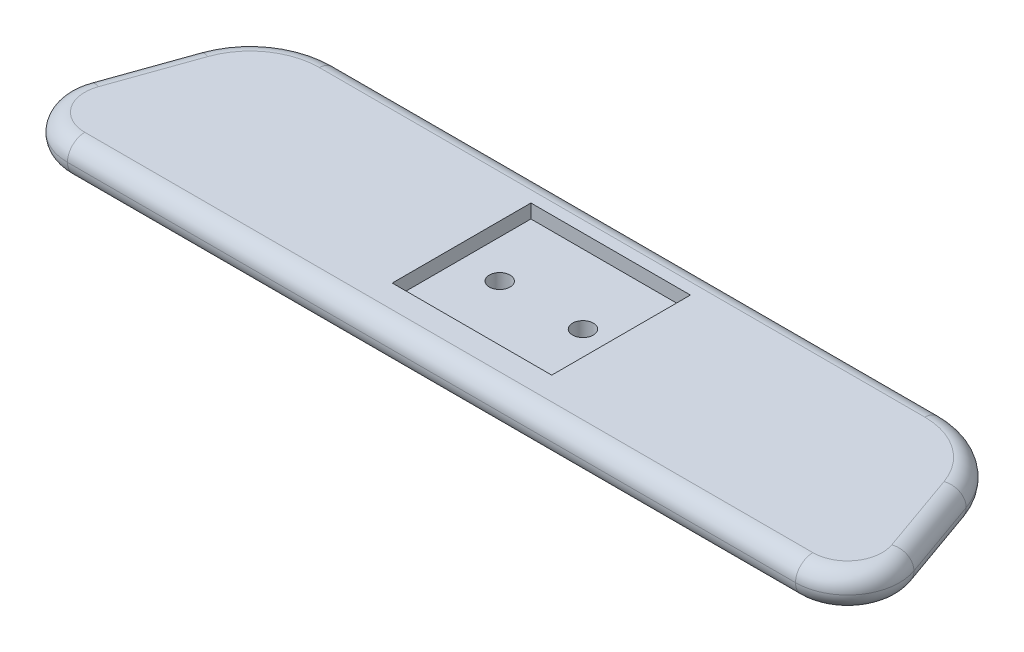
ISO-10303-21;
HEADER;
FILE_DESCRIPTION(('STEP AP214'),'2;1');
FILE_NAME('part.step','',(''),(''),'','','');
FILE_SCHEMA(('AUTOMOTIVE_DESIGN { 1 0 10303 214 1 1 1 1 }'));
ENDSEC;
DATA;
#1=APPLICATION_CONTEXT('core data for automotive mechanical design processes');
#2=APPLICATION_PROTOCOL_DEFINITION('international standard','automotive_design',2000,#1);
#3=PRODUCT_CONTEXT('',#1,'mechanical');
#4=PRODUCT('Part','Part','',(#3));
#5=PRODUCT_RELATED_PRODUCT_CATEGORY('part','',(#4));
#6=PRODUCT_DEFINITION_FORMATION('','',#4);
#7=PRODUCT_DEFINITION_CONTEXT('part definition',#1,'design');
#8=PRODUCT_DEFINITION('design','',#6,#7);
#9=PRODUCT_DEFINITION_SHAPE('','',#8);
#10=(LENGTH_UNIT() NAMED_UNIT(*) SI_UNIT(.MILLI.,.METRE.));
#11=(NAMED_UNIT(*) PLANE_ANGLE_UNIT() SI_UNIT($,.RADIAN.));
#12=(NAMED_UNIT(*) SI_UNIT($,.STERADIAN.) SOLID_ANGLE_UNIT());
#13=UNCERTAINTY_MEASURE_WITH_UNIT(LENGTH_MEASURE(1.E-05),#10,'distance_accuracy_value','');
#14=(GEOMETRIC_REPRESENTATION_CONTEXT(3) GLOBAL_UNCERTAINTY_ASSIGNED_CONTEXT((#13)) GLOBAL_UNIT_ASSIGNED_CONTEXT((#10,
#11,#12)) REPRESENTATION_CONTEXT('',''));
#15=CARTESIAN_POINT('',(0.,0.,0.));
#16=DIRECTION('',(0.,0.,1.));
#17=DIRECTION('',(1.,0.,0.));
#18=AXIS2_PLACEMENT_3D('',#15,#16,#17);
#19=CARTESIAN_POINT('',(-105.,5.,16.6761371846754));
#20=DIRECTION('',(0.,-1.,0.));
#21=DIRECTION('',(0.,0.,-1.));
#22=AXIS2_PLACEMENT_3D('',#19,#20,#21);
#23=PLANE('',#22);
#24=DIRECTION('',(-0.333806859233774,0.,0.942641491092177));
#25=VECTOR('',#24,1.);
#26=CARTESIAN_POINT('',(-114.426414910922,5.,13.3380685923377));
#27=LINE('',#26,#25);
#28=CARTESIAN_POINT('',(-106.16197137538,5.,-10.));
#29=VERTEX_POINT('',#28);
#30=CARTESIAN_POINT('',(-114.426414910922,5.,13.3380685923377));
#31=VERTEX_POINT('',#30);
#32=EDGE_CURVE('E59',#29,#31,#27,.T.);
#33=ORIENTED_EDGE('',*,*,#32,.T.);
#34=CARTESIAN_POINT('',(-105.,5.,16.6761371846754));
#35=DIRECTION('',(0.,-1.,0.));
#36=DIRECTION('',(0.,0.,-1.));
#37=AXIS2_PLACEMENT_3D('',#34,#35,#36);
#38=CIRCLE('',#37,9.99999999999999);
#39=CARTESIAN_POINT('',(-105.,5.,26.6761371846754));
#40=VERTEX_POINT('',#39);
#41=EDGE_CURVE('E12',#31,#40,#38,.F.);
#42=ORIENTED_EDGE('',*,*,#41,.T.);
#43=DIRECTION('',(1.,0.,0.));
#44=VECTOR('',#43,1.);
#45=CARTESIAN_POINT('',(-105.,5.,26.6761371846754));
#46=LINE('',#45,#44);
#47=CARTESIAN_POINT('',(105.,5.,26.6761371846755));
#48=VERTEX_POINT('',#47);
#49=EDGE_CURVE('E350',#40,#48,#46,.T.);
#50=ORIENTED_EDGE('',*,*,#49,.T.);
#51=CARTESIAN_POINT('',(105.,5.,16.6761371846755));
#52=DIRECTION('',(0.,-1.,0.));
#53=DIRECTION('',(0.,0.,-1.));
#54=AXIS2_PLACEMENT_3D('',#51,#52,#53);
#55=CIRCLE('',#54,10.);
#56=CARTESIAN_POINT('',(114.426414910922,5.,13.3380685923377));
#57=VERTEX_POINT('',#56);
#58=EDGE_CURVE('E351',#48,#57,#55,.F.);
#59=ORIENTED_EDGE('',*,*,#58,.T.);
#60=DIRECTION('',(-0.333806859233772,0.,-0.942641491092178));
#61=VECTOR('',#60,1.);
#62=CARTESIAN_POINT('',(91.0267408639035,5.,-52.7405724678954));
#63=LINE('',#62,#61);
#64=CARTESIAN_POINT('',(106.16197137538,5.,-9.99999999999998));
#65=VERTEX_POINT('',#64);
#66=EDGE_CURVE('E353',#57,#65,#63,.T.);
#67=ORIENTED_EDGE('',*,*,#66,.T.);
#68=CARTESIAN_POINT('',(87.309141553536,5.,-3.32386281532454));
#69=DIRECTION('',(0.,-1.,0.));
#70=DIRECTION('',(0.,0.,-1.));
#71=AXIS2_PLACEMENT_3D('',#68,#69,#70);
#72=CIRCLE('',#71,20.);
#73=CARTESIAN_POINT('',(87.309141553536,5.,-23.3238628153245));
#74=VERTEX_POINT('',#73);
#75=EDGE_CURVE('E173',#65,#74,#72,.F.);
#76=ORIENTED_EDGE('',*,*,#75,.T.);
#77=DIRECTION('',(-1.,0.,0.));
#78=VECTOR('',#77,1.);
#79=CARTESIAN_POINT('',(-105.,5.,-23.3238628153246));
#80=LINE('',#79,#78);
#81=CARTESIAN_POINT('',(-87.309141553536,5.,-23.3238628153246));
#82=VERTEX_POINT('',#81);
#83=EDGE_CURVE('E166',#74,#82,#80,.T.);
#84=ORIENTED_EDGE('',*,*,#83,.T.);
#85=CARTESIAN_POINT('',(-87.309141553536,5.,-3.32386281532456));
#86=DIRECTION('',(0.,-1.,0.));
#87=DIRECTION('',(0.,0.,-1.));
#88=AXIS2_PLACEMENT_3D('',#85,#86,#87);
#89=CIRCLE('',#88,20.);
#90=EDGE_CURVE('E171',#82,#29,#89,.F.);
#91=ORIENTED_EDGE('',*,*,#90,.T.);
#92=EDGE_LOOP('',(#33,#42,#50,#59,#67,#76,#84,#91));
#93=FACE_BOUND('',#92,.T.);
#94=DIRECTION('',(0.,0.,-1.));
#95=VECTOR('',#94,1.);
#96=CARTESIAN_POINT('',(23.,5.,16.6761371846754));
#97=LINE('',#96,#95);
#98=CARTESIAN_POINT('',(23.,5.,20.));
#99=VERTEX_POINT('',#98);
#100=CARTESIAN_POINT('',(23.,5.,-20.));
#101=VERTEX_POINT('',#100);
#102=EDGE_CURVE('E318',#99,#101,#97,.T.);
#103=ORIENTED_EDGE('',*,*,#102,.F.);
#104=DIRECTION('',(1.,0.,0.));
#105=VECTOR('',#104,1.);
#106=CARTESIAN_POINT('',(-105.,5.,20.));
#107=LINE('',#106,#105);
#108=CARTESIAN_POINT('',(-23.,5.,20.));
#109=VERTEX_POINT('',#108);
#110=EDGE_CURVE('E309',#109,#99,#107,.T.);
#111=ORIENTED_EDGE('',*,*,#110,.F.);
#112=DIRECTION('',(0.,0.,1.));
#113=VECTOR('',#112,1.);
#114=CARTESIAN_POINT('',(-23.,5.,16.6761371846754));
#115=LINE('',#114,#113);
#116=CARTESIAN_POINT('',(-23.,5.,-20.));
#117=VERTEX_POINT('',#116);
#118=EDGE_CURVE('E312',#117,#109,#115,.T.);
#119=ORIENTED_EDGE('',*,*,#118,.F.);
#120=DIRECTION('',(-1.,0.,0.));
#121=VECTOR('',#120,1.);
#122=CARTESIAN_POINT('',(-105.,5.,-20.));
#123=LINE('',#122,#121);
#124=EDGE_CURVE('E320',#101,#117,#123,.T.);
#125=ORIENTED_EDGE('',*,*,#124,.F.);
#126=EDGE_LOOP('',(#103,#111,#119,#125));
#127=FACE_BOUND('',#126,.T.);
#128=ADVANCED_FACE('F50',(#93,#127),#23,.F.);
#129=CARTESIAN_POINT('',(-105.,-5.,16.6761371846754));
#130=DIRECTION('',(0.,-1.,0.));
#131=DIRECTION('',(0.,0.,-1.));
#132=AXIS2_PLACEMENT_3D('',#129,#130,#131);
#133=PLANE('',#132);
#134=DIRECTION('',(-1.,0.,0.));
#135=VECTOR('',#134,1.);
#136=CARTESIAN_POINT('',(87.309141553536,-5.,-23.3238628153245));
#137=LINE('',#136,#135);
#138=CARTESIAN_POINT('',(-87.309141553536,-5.,-23.3238628153245));
#139=VERTEX_POINT('',#138);
#140=CARTESIAN_POINT('',(87.309141553536,-5.,-23.3238628153245));
#141=VERTEX_POINT('',#140);
#142=EDGE_CURVE('E325',#139,#141,#137,.F.);
#143=ORIENTED_EDGE('',*,*,#142,.T.);
#144=CARTESIAN_POINT('',(87.309141553536,-5.,-3.32386281532454));
#145=DIRECTION('',(0.,-1.,0.));
#146=DIRECTION('',(0.,0.,-1.));
#147=AXIS2_PLACEMENT_3D('',#144,#145,#146);
#148=CIRCLE('',#147,20.);
#149=CARTESIAN_POINT('',(106.16197137538,-5.,-9.99999999999999));
#150=VERTEX_POINT('',#149);
#151=EDGE_CURVE('E343',#141,#150,#148,.T.);
#152=ORIENTED_EDGE('',*,*,#151,.T.);
#153=DIRECTION('',(-0.333806859233772,0.,-0.942641491092178));
#154=VECTOR('',#153,1.);
#155=CARTESIAN_POINT('',(114.426414910922,-5.,13.3380685923377));
#156=LINE('',#155,#154);
#157=CARTESIAN_POINT('',(114.426414910922,-5.,13.3380685923377));
#158=VERTEX_POINT('',#157);
#159=EDGE_CURVE('E344',#150,#158,#156,.F.);
#160=ORIENTED_EDGE('',*,*,#159,.T.);
#161=CARTESIAN_POINT('',(105.,-5.,16.6761371846755));
#162=DIRECTION('',(0.,-1.,0.));
#163=DIRECTION('',(0.,0.,-1.));
#164=AXIS2_PLACEMENT_3D('',#161,#162,#163);
#165=CIRCLE('',#164,10.);
#166=CARTESIAN_POINT('',(105.,-5.,26.6761371846755));
#167=VERTEX_POINT('',#166);
#168=EDGE_CURVE('E336',#158,#167,#165,.T.);
#169=ORIENTED_EDGE('',*,*,#168,.T.);
#170=DIRECTION('',(1.,0.,0.));
#171=VECTOR('',#170,1.);
#172=CARTESIAN_POINT('',(-105.,-5.,26.6761371846754));
#173=LINE('',#172,#171);
#174=CARTESIAN_POINT('',(-105.,-5.,26.6761371846754));
#175=VERTEX_POINT('',#174);
#176=EDGE_CURVE('E334',#167,#175,#173,.F.);
#177=ORIENTED_EDGE('',*,*,#176,.T.);
#178=CARTESIAN_POINT('',(-105.,-5.,16.6761371846754));
#179=DIRECTION('',(0.,-1.,0.));
#180=DIRECTION('',(0.,0.,-1.));
#181=AXIS2_PLACEMENT_3D('',#178,#179,#180);
#182=CIRCLE('',#181,9.99999999999999);
#183=CARTESIAN_POINT('',(-114.426414910922,-5.,13.3380685923377));
#184=VERTEX_POINT('',#183);
#185=EDGE_CURVE('E335',#175,#184,#182,.T.);
#186=ORIENTED_EDGE('',*,*,#185,.T.);
#187=DIRECTION('',(-0.333806859233774,0.,0.942641491092177));
#188=VECTOR('',#187,1.);
#189=CARTESIAN_POINT('',(-106.16197137538,-5.,-10.));
#190=LINE('',#189,#188);
#191=CARTESIAN_POINT('',(-106.16197137538,-5.,-10.));
#192=VERTEX_POINT('',#191);
#193=EDGE_CURVE('E326',#184,#192,#190,.F.);
#194=ORIENTED_EDGE('',*,*,#193,.T.);
#195=CARTESIAN_POINT('',(-87.309141553536,-5.,-3.32386281532456));
#196=DIRECTION('',(0.,-1.,0.));
#197=DIRECTION('',(0.,0.,-1.));
#198=AXIS2_PLACEMENT_3D('',#195,#196,#197);
#199=CIRCLE('',#198,20.);
#200=EDGE_CURVE('E327',#192,#139,#199,.T.);
#201=ORIENTED_EDGE('',*,*,#200,.T.);
#202=EDGE_LOOP('',(#143,#152,#160,#169,#177,#186,#194,#201));
#203=FACE_BOUND('',#202,.T.);
#204=CARTESIAN_POINT('',(70.,-5.,9.67613718467545));
#205=DIRECTION('',(0.,-1.,0.));
#206=DIRECTION('',(0.,0.,-1.));
#207=AXIS2_PLACEMENT_3D('',#204,#205,#206);
#208=CIRCLE('',#207,2.);
#209=CARTESIAN_POINT('',(70.,-5.,7.67613718467545));
#210=VERTEX_POINT('',#209);
#211=EDGE_CURVE('E250',#210,#210,#208,.T.);
#212=ORIENTED_EDGE('',*,*,#211,.F.);
#213=EDGE_LOOP('',(#212));
#214=FACE_BOUND('',#213,.T.);
#215=CARTESIAN_POINT('',(70.,-5.,-6.32386281532455));
#216=DIRECTION('',(0.,-1.,0.));
#217=DIRECTION('',(0.,0.,-1.));
#218=AXIS2_PLACEMENT_3D('',#215,#216,#217);
#219=CIRCLE('',#218,2.);
#220=CARTESIAN_POINT('',(70.,-5.,-8.32386281532455));
#221=VERTEX_POINT('',#220);
#222=EDGE_CURVE('E736',#221,#221,#219,.T.);
#223=ORIENTED_EDGE('',*,*,#222,.F.);
#224=EDGE_LOOP('',(#223));
#225=FACE_BOUND('',#224,.T.);
#226=CARTESIAN_POINT('',(-70.,-5.,-6.32386281532455));
#227=DIRECTION('',(0.,-1.,0.));
#228=DIRECTION('',(0.,0.,-1.));
#229=AXIS2_PLACEMENT_3D('',#226,#227,#228);
#230=CIRCLE('',#229,2.);
#231=CARTESIAN_POINT('',(-70.,-5.,-8.32386281532455));
#232=VERTEX_POINT('',#231);
#233=EDGE_CURVE('E270',#232,#232,#230,.T.);
#234=ORIENTED_EDGE('',*,*,#233,.F.);
#235=EDGE_LOOP('',(#234));
#236=FACE_BOUND('',#235,.T.);
#237=CARTESIAN_POINT('',(-70.,-5.,9.67613718467545));
#238=DIRECTION('',(0.,-1.,0.));
#239=DIRECTION('',(0.,0.,-1.));
#240=AXIS2_PLACEMENT_3D('',#237,#238,#239);
#241=CIRCLE('',#240,2.);
#242=CARTESIAN_POINT('',(-70.,-5.,7.67613718467545));
#243=VERTEX_POINT('',#242);
#244=EDGE_CURVE('E265',#243,#243,#241,.T.);
#245=ORIENTED_EDGE('',*,*,#244,.F.);
#246=EDGE_LOOP('',(#245));
#247=FACE_BOUND('',#246,.T.);
#248=CARTESIAN_POINT('',(12.,-5.,0.));
#249=DIRECTION('',(0.,1.,0.));
#250=DIRECTION('',(0.,0.,1.));
#251=AXIS2_PLACEMENT_3D('',#248,#249,#250);
#252=CIRCLE('',#251,3.);
#253=CARTESIAN_POINT('',(12.,-5.,3.));
#254=VERTEX_POINT('',#253);
#255=EDGE_CURVE('E267',#254,#254,#252,.T.);
#256=ORIENTED_EDGE('',*,*,#255,.T.);
#257=EDGE_LOOP('',(#256));
#258=FACE_BOUND('',#257,.T.);
#259=CARTESIAN_POINT('',(-12.,-5.,0.));
#260=DIRECTION('',(0.,1.,0.));
#261=DIRECTION('',(0.,0.,1.));
#262=AXIS2_PLACEMENT_3D('',#259,#260,#261);
#263=CIRCLE('',#262,3.);
#264=CARTESIAN_POINT('',(-12.,-5.,3.));
#265=VERTEX_POINT('',#264);
#266=EDGE_CURVE('E264',#265,#265,#263,.T.);
#267=ORIENTED_EDGE('',*,*,#266,.T.);
#268=EDGE_LOOP('',(#267));
#269=FACE_BOUND('',#268,.T.);
#270=ADVANCED_FACE('F416',(#203,#214,#225,#236,#247,#258,#269),#133,.T.);
#271=CARTESIAN_POINT('',(23.,5.000012,-20.));
#272=DIRECTION('',(-1.,0.,0.));
#273=DIRECTION('',(0.,0.,1.));
#274=AXIS2_PLACEMENT_3D('',#271,#272,#273);
#275=PLANE('',#274);
#276=ORIENTED_EDGE('',*,*,#102,.T.);
#277=DIRECTION('',(0.,-1.,0.));
#278=VECTOR('',#277,1.);
#279=CARTESIAN_POINT('',(23.,5.000012,-20.));
#280=LINE('',#279,#278);
#281=CARTESIAN_POINT('',(23.,1.,-20.));
#282=VERTEX_POINT('',#281);
#283=EDGE_CURVE('E110',#101,#282,#280,.T.);
#284=ORIENTED_EDGE('',*,*,#283,.T.);
#285=DIRECTION('',(0.,0.,-1.));
#286=VECTOR('',#285,1.);
#287=CARTESIAN_POINT('',(23.,1.,-20.));
#288=LINE('',#287,#286);
#289=CARTESIAN_POINT('',(23.,1.,20.));
#290=VERTEX_POINT('',#289);
#291=EDGE_CURVE('E275',#290,#282,#288,.T.);
#292=ORIENTED_EDGE('',*,*,#291,.F.);
#293=DIRECTION('',(0.,-1.,0.));
#294=VECTOR('',#293,1.);
#295=CARTESIAN_POINT('',(23.,5.000012,20.));
#296=LINE('',#295,#294);
#297=EDGE_CURVE('E299',#99,#290,#296,.T.);
#298=ORIENTED_EDGE('',*,*,#297,.F.);
#299=EDGE_LOOP('',(#276,#284,#292,#298));
#300=FACE_BOUND('',#299,.T.);
#301=ADVANCED_FACE('F422',(#300),#275,.T.);
#302=CARTESIAN_POINT('',(-23.,5.000012,-20.));
#303=DIRECTION('',(0.,0.,1.));
#304=DIRECTION('',(1.,0.,0.));
#305=AXIS2_PLACEMENT_3D('',#302,#303,#304);
#306=PLANE('',#305);
#307=ORIENTED_EDGE('',*,*,#124,.T.);
#308=DIRECTION('',(0.,-1.,0.));
#309=VECTOR('',#308,1.);
#310=CARTESIAN_POINT('',(-23.,5.000012,-20.));
#311=LINE('',#310,#309);
#312=CARTESIAN_POINT('',(-23.,1.,-20.));
#313=VERTEX_POINT('',#312);
#314=EDGE_CURVE('E304',#117,#313,#311,.T.);
#315=ORIENTED_EDGE('',*,*,#314,.T.);
#316=DIRECTION('',(-1.,0.,0.));
#317=VECTOR('',#316,1.);
#318=CARTESIAN_POINT('',(-23.,1.,-20.));
#319=LINE('',#318,#317);
#320=EDGE_CURVE('E290',#282,#313,#319,.T.);
#321=ORIENTED_EDGE('',*,*,#320,.F.);
#322=ORIENTED_EDGE('',*,*,#283,.F.);
#323=EDGE_LOOP('',(#307,#315,#321,#322));
#324=FACE_BOUND('',#323,.T.);
#325=ADVANCED_FACE('F530',(#324),#306,.T.);
#326=CARTESIAN_POINT('',(-23.,5.000012,-20.));
#327=DIRECTION('',(1.,0.,0.));
#328=DIRECTION('',(0.,0.,-1.));
#329=AXIS2_PLACEMENT_3D('',#326,#327,#328);
#330=PLANE('',#329);
#331=ORIENTED_EDGE('',*,*,#118,.T.);
#332=DIRECTION('',(0.,-1.,0.));
#333=VECTOR('',#332,1.);
#334=CARTESIAN_POINT('',(-23.,5.000012,20.));
#335=LINE('',#334,#333);
#336=CARTESIAN_POINT('',(-23.,1.,20.));
#337=VERTEX_POINT('',#336);
#338=EDGE_CURVE('E305',#109,#337,#335,.T.);
#339=ORIENTED_EDGE('',*,*,#338,.T.);
#340=DIRECTION('',(0.,0.,1.));
#341=VECTOR('',#340,1.);
#342=CARTESIAN_POINT('',(-23.,1.,-20.));
#343=LINE('',#342,#341);
#344=EDGE_CURVE('E293',#313,#337,#343,.T.);
#345=ORIENTED_EDGE('',*,*,#344,.F.);
#346=ORIENTED_EDGE('',*,*,#314,.F.);
#347=EDGE_LOOP('',(#331,#339,#345,#346));
#348=FACE_BOUND('',#347,.T.);
#349=ADVANCED_FACE('F521',(#348),#330,.T.);
#350=CARTESIAN_POINT('',(-23.,5.000012,20.));
#351=DIRECTION('',(0.,0.,-1.));
#352=DIRECTION('',(-1.,0.,0.));
#353=AXIS2_PLACEMENT_3D('',#350,#351,#352);
#354=PLANE('',#353);
#355=ORIENTED_EDGE('',*,*,#110,.T.);
#356=ORIENTED_EDGE('',*,*,#297,.T.);
#357=DIRECTION('',(1.,0.,0.));
#358=VECTOR('',#357,1.);
#359=CARTESIAN_POINT('',(-23.,1.,20.));
#360=LINE('',#359,#358);
#361=EDGE_CURVE('E294',#337,#290,#360,.T.);
#362=ORIENTED_EDGE('',*,*,#361,.F.);
#363=ORIENTED_EDGE('',*,*,#338,.F.);
#364=EDGE_LOOP('',(#355,#356,#362,#363));
#365=FACE_BOUND('',#364,.T.);
#366=ADVANCED_FACE('F517',(#365),#354,.T.);
#367=CARTESIAN_POINT('',(0.,1.,0.));
#368=DIRECTION('',(0.,1.,0.));
#369=DIRECTION('',(0.,0.,1.));
#370=AXIS2_PLACEMENT_3D('',#367,#368,#369);
#371=PLANE('',#370);
#372=CARTESIAN_POINT('',(12.,1.,0.));
#373=DIRECTION('',(0.,1.,0.));
#374=DIRECTION('',(0.,0.,1.));
#375=AXIS2_PLACEMENT_3D('',#372,#373,#374);
#376=CIRCLE('',#375,3.);
#377=CARTESIAN_POINT('',(12.,1.,3.));
#378=VERTEX_POINT('',#377);
#379=EDGE_CURVE('E271',#378,#378,#376,.T.);
#380=ORIENTED_EDGE('',*,*,#379,.F.);
#381=EDGE_LOOP('',(#380));
#382=FACE_BOUND('',#381,.T.);
#383=CARTESIAN_POINT('',(-12.,1.,0.));
#384=DIRECTION('',(0.,1.,0.));
#385=DIRECTION('',(0.,0.,1.));
#386=AXIS2_PLACEMENT_3D('',#383,#384,#385);
#387=CIRCLE('',#386,3.);
#388=CARTESIAN_POINT('',(-12.,1.,3.));
#389=VERTEX_POINT('',#388);
#390=EDGE_CURVE('E276',#389,#389,#387,.T.);
#391=ORIENTED_EDGE('',*,*,#390,.F.);
#392=EDGE_LOOP('',(#391));
#393=FACE_BOUND('',#392,.T.);
#394=ORIENTED_EDGE('',*,*,#291,.T.);
#395=ORIENTED_EDGE('',*,*,#320,.T.);
#396=ORIENTED_EDGE('',*,*,#344,.T.);
#397=ORIENTED_EDGE('',*,*,#361,.T.);
#398=EDGE_LOOP('',(#394,#395,#396,#397));
#399=FACE_BOUND('',#398,.T.);
#400=ADVANCED_FACE('F519',(#382,#393,#399),#371,.T.);
#401=CARTESIAN_POINT('',(-12.,-5.,0.));
#402=DIRECTION('',(0.,1.,0.));
#403=DIRECTION('',(0.,0.,1.));
#404=AXIS2_PLACEMENT_3D('',#401,#402,#403);
#405=CYLINDRICAL_SURFACE('',#404,3.);
#406=ORIENTED_EDGE('',*,*,#266,.F.);
#407=EDGE_LOOP('',(#406));
#408=FACE_BOUND('',#407,.T.);
#409=ORIENTED_EDGE('',*,*,#390,.T.);
#410=EDGE_LOOP('',(#409));
#411=FACE_BOUND('',#410,.T.);
#412=ADVANCED_FACE('F515',(#408,#411),#405,.F.);
#413=CARTESIAN_POINT('',(12.,-5.,0.));
#414=DIRECTION('',(0.,1.,0.));
#415=DIRECTION('',(0.,0.,1.));
#416=AXIS2_PLACEMENT_3D('',#413,#414,#415);
#417=CYLINDRICAL_SURFACE('',#416,3.);
#418=ORIENTED_EDGE('',*,*,#255,.F.);
#419=EDGE_LOOP('',(#418));
#420=FACE_BOUND('',#419,.T.);
#421=ORIENTED_EDGE('',*,*,#379,.T.);
#422=EDGE_LOOP('',(#421));
#423=FACE_BOUND('',#422,.T.);
#424=ADVANCED_FACE('F507',(#420,#423),#417,.F.);
#425=CARTESIAN_POINT('',(-70.,3.,9.67613718467545));
#426=DIRECTION('',(0.,-1.,0.));
#427=DIRECTION('',(0.,0.,-1.));
#428=AXIS2_PLACEMENT_3D('',#425,#426,#427);
#429=CYLINDRICAL_SURFACE('',#428,2.);
#430=CARTESIAN_POINT('',(-70.,3.,9.67613718467545));
#431=DIRECTION('',(0.,-1.,0.));
#432=DIRECTION('',(0.,0.,-1.));
#433=AXIS2_PLACEMENT_3D('',#430,#431,#432);
#434=CIRCLE('',#433,2.);
#435=CARTESIAN_POINT('',(-70.,3.,7.67613718467545));
#436=VERTEX_POINT('',#435);
#437=EDGE_CURVE('E260',#436,#436,#434,.T.);
#438=ORIENTED_EDGE('',*,*,#437,.F.);
#439=EDGE_LOOP('',(#438));
#440=FACE_BOUND('',#439,.T.);
#441=ORIENTED_EDGE('',*,*,#244,.T.);
#442=EDGE_LOOP('',(#441));
#443=FACE_BOUND('',#442,.T.);
#444=ADVANCED_FACE('F502',(#440,#443),#429,.F.);
#445=CARTESIAN_POINT('',(-70.,3.,9.67613718467545));
#446=DIRECTION('',(0.,-1.,0.));
#447=DIRECTION('',(0.,0.,-1.));
#448=AXIS2_PLACEMENT_3D('',#445,#446,#447);
#449=PLANE('',#448);
#450=ORIENTED_EDGE('',*,*,#437,.T.);
#451=EDGE_LOOP('',(#450));
#452=FACE_BOUND('',#451,.T.);
#453=ADVANCED_FACE('F499',(#452),#449,.T.);
#454=CARTESIAN_POINT('',(-70.,3.,-6.32386281532455));
#455=DIRECTION('',(0.,-1.,0.));
#456=DIRECTION('',(0.,0.,-1.));
#457=AXIS2_PLACEMENT_3D('',#454,#455,#456);
#458=CYLINDRICAL_SURFACE('',#457,2.);
#459=CARTESIAN_POINT('',(-70.,3.,-6.32386281532455));
#460=DIRECTION('',(0.,-1.,0.));
#461=DIRECTION('',(0.,0.,-1.));
#462=AXIS2_PLACEMENT_3D('',#459,#460,#461);
#463=CIRCLE('',#462,2.);
#464=CARTESIAN_POINT('',(-70.,3.,-8.32386281532455));
#465=VERTEX_POINT('',#464);
#466=EDGE_CURVE('E742',#465,#465,#463,.T.);
#467=ORIENTED_EDGE('',*,*,#466,.F.);
#468=EDGE_LOOP('',(#467));
#469=FACE_BOUND('',#468,.T.);
#470=ORIENTED_EDGE('',*,*,#233,.T.);
#471=EDGE_LOOP('',(#470));
#472=FACE_BOUND('',#471,.T.);
#473=ADVANCED_FACE('F503',(#469,#472),#458,.F.);
#474=CARTESIAN_POINT('',(-70.,3.,-6.32386281532455));
#475=DIRECTION('',(0.,-1.,0.));
#476=DIRECTION('',(0.,0.,-1.));
#477=AXIS2_PLACEMENT_3D('',#474,#475,#476);
#478=PLANE('',#477);
#479=ORIENTED_EDGE('',*,*,#466,.T.);
#480=EDGE_LOOP('',(#479));
#481=FACE_BOUND('',#480,.T.);
#482=ADVANCED_FACE('F602',(#481),#478,.T.);
#483=CARTESIAN_POINT('',(70.,3.,-6.32386281532455));
#484=DIRECTION('',(0.,-1.,0.));
#485=DIRECTION('',(0.,0.,-1.));
#486=AXIS2_PLACEMENT_3D('',#483,#484,#485);
#487=CYLINDRICAL_SURFACE('',#486,2.);
#488=CARTESIAN_POINT('',(70.,3.,-6.32386281532455));
#489=DIRECTION('',(0.,-1.,0.));
#490=DIRECTION('',(0.,0.,-1.));
#491=AXIS2_PLACEMENT_3D('',#488,#489,#490);
#492=CIRCLE('',#491,2.);
#493=CARTESIAN_POINT('',(70.,3.,-8.32386281532455));
#494=VERTEX_POINT('',#493);
#495=EDGE_CURVE('E251',#494,#494,#492,.T.);
#496=ORIENTED_EDGE('',*,*,#495,.F.);
#497=EDGE_LOOP('',(#496));
#498=FACE_BOUND('',#497,.T.);
#499=ORIENTED_EDGE('',*,*,#222,.T.);
#500=EDGE_LOOP('',(#499));
#501=FACE_BOUND('',#500,.T.);
#502=ADVANCED_FACE('F614',(#498,#501),#487,.F.);
#503=CARTESIAN_POINT('',(70.,3.,-6.32386281532455));
#504=DIRECTION('',(0.,-1.,0.));
#505=DIRECTION('',(0.,0.,-1.));
#506=AXIS2_PLACEMENT_3D('',#503,#504,#505);
#507=PLANE('',#506);
#508=ORIENTED_EDGE('',*,*,#495,.T.);
#509=EDGE_LOOP('',(#508));
#510=FACE_BOUND('',#509,.T.);
#511=ADVANCED_FACE('F492',(#510),#507,.T.);
#512=CARTESIAN_POINT('',(70.,3.,9.67613718467545));
#513=DIRECTION('',(0.,-1.,0.));
#514=DIRECTION('',(0.,0.,-1.));
#515=AXIS2_PLACEMENT_3D('',#512,#513,#514);
#516=CYLINDRICAL_SURFACE('',#515,2.);
#517=CARTESIAN_POINT('',(70.,3.,9.67613718467545));
#518=DIRECTION('',(0.,-1.,0.));
#519=DIRECTION('',(0.,0.,-1.));
#520=AXIS2_PLACEMENT_3D('',#517,#518,#519);
#521=CIRCLE('',#520,2.);
#522=CARTESIAN_POINT('',(70.,3.,7.67613718467545));
#523=VERTEX_POINT('',#522);
#524=EDGE_CURVE('E243',#523,#523,#521,.T.);
#525=ORIENTED_EDGE('',*,*,#524,.F.);
#526=EDGE_LOOP('',(#525));
#527=FACE_BOUND('',#526,.T.);
#528=ORIENTED_EDGE('',*,*,#211,.T.);
#529=EDGE_LOOP('',(#528));
#530=FACE_BOUND('',#529,.T.);
#531=ADVANCED_FACE('F489',(#527,#530),#516,.F.);
#532=CARTESIAN_POINT('',(70.,3.,9.67613718467545));
#533=DIRECTION('',(0.,-1.,0.));
#534=DIRECTION('',(0.,0.,-1.));
#535=AXIS2_PLACEMENT_3D('',#532,#533,#534);
#536=PLANE('',#535);
#537=ORIENTED_EDGE('',*,*,#524,.T.);
#538=EDGE_LOOP('',(#537));
#539=FACE_BOUND('',#538,.T.);
#540=ADVANCED_FACE('F487',(#539),#536,.T.);
#541=CARTESIAN_POINT('',(-105.,0.,16.6761371846754));
#542=DIRECTION('',(0.,-1.,0.));
#543=DIRECTION('',(0.,0.,-1.));
#544=AXIS2_PLACEMENT_3D('',#541,#542,#543);
#545=TOROIDAL_SURFACE('',#544,9.99999999999999,5.);
#546=CARTESIAN_POINT('',(-105.,0.,26.6761371846754));
#547=DIRECTION('',(1.,0.,0.));
#548=DIRECTION('',(0.,0.,-1.));
#549=AXIS2_PLACEMENT_3D('',#546,#547,#548);
#550=CIRCLE('',#549,5.);
#551=CARTESIAN_POINT('',(-105.,0.,31.6761371846754));
#552=VERTEX_POINT('',#551);
#553=EDGE_CURVE('E51',#40,#552,#550,.T.);
#554=ORIENTED_EDGE('',*,*,#553,.F.);
#555=ORIENTED_EDGE('',*,*,#41,.F.);
#556=CARTESIAN_POINT('',(-114.426414910922,0.,13.3380685923377));
#557=DIRECTION('',(0.333806859233775,0.,-0.942641491092177));
#558=DIRECTION('',(-0.942641491092177,0.,-0.333806859233775));
#559=AXIS2_PLACEMENT_3D('',#556,#557,#558);
#560=CIRCLE('',#559,5.);
#561=CARTESIAN_POINT('',(-119.139622366383,0.,11.6690342961688));
#562=VERTEX_POINT('',#561);
#563=EDGE_CURVE('E92',#562,#31,#560,.T.);
#564=ORIENTED_EDGE('',*,*,#563,.F.);
#565=CARTESIAN_POINT('',(-105.,0.,16.6761371846754));
#566=DIRECTION('',(0.,-1.,0.));
#567=DIRECTION('',(0.,0.,-1.));
#568=AXIS2_PLACEMENT_3D('',#565,#566,#567);
#569=CIRCLE('',#568,15.);
#570=EDGE_CURVE('E236',#552,#562,#569,.T.);
#571=ORIENTED_EDGE('',*,*,#570,.F.);
#572=EDGE_LOOP('',(#554,#555,#564,#571));
#573=FACE_BOUND('',#572,.T.);
#574=ADVANCED_FACE('F47',(#573),#545,.T.);
#575=CARTESIAN_POINT('',(-105.,0.,26.6761371846754));
#576=DIRECTION('',(1.,0.,0.));
#577=DIRECTION('',(0.,0.,-1.));
#578=AXIS2_PLACEMENT_3D('',#575,#576,#577);
#579=CYLINDRICAL_SURFACE('',#578,5.);
#580=ORIENTED_EDGE('',*,*,#49,.F.);
#581=ORIENTED_EDGE('',*,*,#553,.T.);
#582=DIRECTION('',(1.,0.,0.));
#583=VECTOR('',#582,1.);
#584=CARTESIAN_POINT('',(-105.,0.,31.6761371846754));
#585=LINE('',#584,#583);
#586=CARTESIAN_POINT('',(105.,0.,31.6761371846755));
#587=VERTEX_POINT('',#586);
#588=EDGE_CURVE('E226',#587,#552,#585,.F.);
#589=ORIENTED_EDGE('',*,*,#588,.F.);
#590=CARTESIAN_POINT('',(105.,0.,26.6761371846755));
#591=DIRECTION('',(1.,0.,0.));
#592=DIRECTION('',(0.,0.,-1.));
#593=AXIS2_PLACEMENT_3D('',#590,#591,#592);
#594=CIRCLE('',#593,5.);
#595=EDGE_CURVE('E223',#48,#587,#594,.T.);
#596=ORIENTED_EDGE('',*,*,#595,.F.);
#597=EDGE_LOOP('',(#580,#581,#589,#596));
#598=FACE_BOUND('',#597,.T.);
#599=ADVANCED_FACE('F409',(#598),#579,.T.);
#600=CARTESIAN_POINT('',(-114.426414910922,0.,13.3380685923377));
#601=DIRECTION('',(-0.333806859233774,0.,0.942641491092177));
#602=DIRECTION('',(0.942641491092177,0.,0.333806859233774));
#603=AXIS2_PLACEMENT_3D('',#600,#601,#602);
#604=CYLINDRICAL_SURFACE('',#603,5.);
#605=ORIENTED_EDGE('',*,*,#563,.T.);
#606=ORIENTED_EDGE('',*,*,#32,.F.);
#607=CARTESIAN_POINT('',(-106.16197137538,0.,-10.));
#608=DIRECTION('',(0.333806859233774,0.,-0.942641491092177));
#609=DIRECTION('',(-0.942641491092177,0.,-0.333806859233774));
#610=AXIS2_PLACEMENT_3D('',#607,#608,#609);
#611=CIRCLE('',#610,5.);
#612=CARTESIAN_POINT('',(-110.87517883084,0.,-11.6690342961689));
#613=VERTEX_POINT('',#612);
#614=EDGE_CURVE('E184',#613,#29,#611,.T.);
#615=ORIENTED_EDGE('',*,*,#614,.F.);
#616=DIRECTION('',(-0.333806859233774,0.,0.942641491092177));
#617=VECTOR('',#616,1.);
#618=CARTESIAN_POINT('',(-110.87517883084,0.,-11.6690342961689));
#619=LINE('',#618,#617);
#620=EDGE_CURVE('E220',#562,#613,#619,.F.);
#621=ORIENTED_EDGE('',*,*,#620,.F.);
#622=EDGE_LOOP('',(#605,#606,#615,#621));
#623=FACE_BOUND('',#622,.T.);
#624=ADVANCED_FACE('F401',(#623),#604,.T.);
#625=CARTESIAN_POINT('',(-105.,0.,16.6761371846754));
#626=DIRECTION('',(0.,-1.,0.));
#627=DIRECTION('',(0.,0.,-1.));
#628=AXIS2_PLACEMENT_3D('',#625,#626,#627);
#629=TOROIDAL_SURFACE('',#628,9.99999999999999,5.);
#630=CARTESIAN_POINT('',(-114.426414910922,0.,13.3380685923377));
#631=DIRECTION('',(0.333806859233775,0.,-0.942641491092177));
#632=DIRECTION('',(-0.942641491092177,0.,-0.333806859233775));
#633=AXIS2_PLACEMENT_3D('',#630,#631,#632);
#634=CIRCLE('',#633,5.);
#635=EDGE_CURVE('E213',#184,#562,#634,.T.);
#636=ORIENTED_EDGE('',*,*,#635,.F.);
#637=ORIENTED_EDGE('',*,*,#185,.F.);
#638=CARTESIAN_POINT('',(-105.,0.,26.6761371846754));
#639=DIRECTION('',(1.,0.,0.));
#640=DIRECTION('',(0.,1.,0.));
#641=AXIS2_PLACEMENT_3D('',#638,#639,#640);
#642=CIRCLE('',#641,5.);
#643=EDGE_CURVE('E235',#552,#175,#642,.T.);
#644=ORIENTED_EDGE('',*,*,#643,.F.);
#645=ORIENTED_EDGE('',*,*,#570,.T.);
#646=EDGE_LOOP('',(#636,#637,#644,#645));
#647=FACE_BOUND('',#646,.T.);
#648=ADVANCED_FACE('F403',(#647),#629,.T.);
#649=CARTESIAN_POINT('',(-105.,0.,26.6761371846754));
#650=DIRECTION('',(-1.,0.,0.));
#651=DIRECTION('',(0.,0.,1.));
#652=AXIS2_PLACEMENT_3D('',#649,#650,#651);
#653=CYLINDRICAL_SURFACE('',#652,5.);
#654=ORIENTED_EDGE('',*,*,#643,.T.);
#655=ORIENTED_EDGE('',*,*,#176,.F.);
#656=CARTESIAN_POINT('',(105.,0.,26.6761371846755));
#657=DIRECTION('',(1.,0.,0.));
#658=DIRECTION('',(0.,0.,-1.));
#659=AXIS2_PLACEMENT_3D('',#656,#657,#658);
#660=CIRCLE('',#659,5.);
#661=EDGE_CURVE('E208',#587,#167,#660,.T.);
#662=ORIENTED_EDGE('',*,*,#661,.F.);
#663=ORIENTED_EDGE('',*,*,#588,.T.);
#664=EDGE_LOOP('',(#654,#655,#662,#663));
#665=FACE_BOUND('',#664,.T.);
#666=ADVANCED_FACE('F414',(#665),#653,.T.);
#667=CARTESIAN_POINT('',(105.,0.,16.6761371846755));
#668=DIRECTION('',(0.,-1.,0.));
#669=DIRECTION('',(0.,0.,-1.));
#670=AXIS2_PLACEMENT_3D('',#667,#668,#669);
#671=TOROIDAL_SURFACE('',#670,10.,5.);
#672=ORIENTED_EDGE('',*,*,#58,.F.);
#673=ORIENTED_EDGE('',*,*,#595,.T.);
#674=CARTESIAN_POINT('',(105.,0.,16.6761371846755));
#675=DIRECTION('',(0.,-1.,0.));
#676=DIRECTION('',(0.,0.,-1.));
#677=AXIS2_PLACEMENT_3D('',#674,#675,#676);
#678=CIRCLE('',#677,15.);
#679=CARTESIAN_POINT('',(119.139622366383,0.,11.6690342961689));
#680=VERTEX_POINT('',#679);
#681=EDGE_CURVE('E201',#680,#587,#678,.T.);
#682=ORIENTED_EDGE('',*,*,#681,.F.);
#683=CARTESIAN_POINT('',(114.426414910922,0.,13.3380685923377));
#684=DIRECTION('',(-0.333806859233772,0.,-0.942641491092178));
#685=DIRECTION('',(-0.942641491092178,0.,0.333806859233772));
#686=AXIS2_PLACEMENT_3D('',#683,#684,#685);
#687=CIRCLE('',#686,5.);
#688=EDGE_CURVE('E193',#57,#680,#687,.T.);
#689=ORIENTED_EDGE('',*,*,#688,.F.);
#690=EDGE_LOOP('',(#672,#673,#682,#689));
#691=FACE_BOUND('',#690,.T.);
#692=ADVANCED_FACE('F458',(#691),#671,.T.);
#693=CARTESIAN_POINT('',(-87.309141553536,0.,-3.32386281532456));
#694=DIRECTION('',(0.,-1.,0.));
#695=DIRECTION('',(0.,0.,-1.));
#696=AXIS2_PLACEMENT_3D('',#693,#694,#695);
#697=TOROIDAL_SURFACE('',#696,20.,5.);
#698=ORIENTED_EDGE('',*,*,#614,.T.);
#699=ORIENTED_EDGE('',*,*,#90,.F.);
#700=CARTESIAN_POINT('',(-87.309141553536,0.,-23.3238628153246));
#701=DIRECTION('',(1.,0.,0.));
#702=DIRECTION('',(0.,0.,-1.));
#703=AXIS2_PLACEMENT_3D('',#700,#701,#702);
#704=CIRCLE('',#703,5.);
#705=CARTESIAN_POINT('',(-87.309141553536,0.,-28.3238628153245));
#706=VERTEX_POINT('',#705);
#707=EDGE_CURVE('E182',#706,#82,#704,.T.);
#708=ORIENTED_EDGE('',*,*,#707,.F.);
#709=CARTESIAN_POINT('',(-87.309141553536,0.,-3.32386281532456));
#710=DIRECTION('',(0.,-1.,0.));
#711=DIRECTION('',(0.,0.,-1.));
#712=AXIS2_PLACEMENT_3D('',#709,#710,#711);
#713=CIRCLE('',#712,25.);
#714=EDGE_CURVE('E192',#613,#706,#713,.T.);
#715=ORIENTED_EDGE('',*,*,#714,.F.);
#716=EDGE_LOOP('',(#698,#699,#708,#715));
#717=FACE_BOUND('',#716,.T.);
#718=ADVANCED_FACE('F181',(#717),#697,.T.);
#719=CARTESIAN_POINT('',(-106.16197137538,0.,-10.));
#720=DIRECTION('',(0.333806859233774,0.,-0.942641491092177));
#721=DIRECTION('',(-0.942641491092177,0.,-0.333806859233774));
#722=AXIS2_PLACEMENT_3D('',#719,#720,#721);
#723=CYLINDRICAL_SURFACE('',#722,5.);
#724=ORIENTED_EDGE('',*,*,#635,.T.);
#725=ORIENTED_EDGE('',*,*,#620,.T.);
#726=CARTESIAN_POINT('',(-106.16197137538,0.,-10.));
#727=DIRECTION('',(0.333806859233774,0.,-0.942641491092177));
#728=DIRECTION('',(-0.942641491092177,0.,-0.333806859233774));
#729=AXIS2_PLACEMENT_3D('',#726,#727,#728);
#730=CIRCLE('',#729,5.);
#731=EDGE_CURVE('E202',#192,#613,#730,.T.);
#732=ORIENTED_EDGE('',*,*,#731,.F.);
#733=ORIENTED_EDGE('',*,*,#193,.F.);
#734=EDGE_LOOP('',(#724,#725,#732,#733));
#735=FACE_BOUND('',#734,.T.);
#736=ADVANCED_FACE('F402',(#735),#723,.T.);
#737=CARTESIAN_POINT('',(105.,0.,16.6761371846755));
#738=DIRECTION('',(0.,-1.,0.));
#739=DIRECTION('',(0.,0.,-1.));
#740=AXIS2_PLACEMENT_3D('',#737,#738,#739);
#741=TOROIDAL_SURFACE('',#740,10.,5.);
#742=ORIENTED_EDGE('',*,*,#661,.T.);
#743=ORIENTED_EDGE('',*,*,#168,.F.);
#744=CARTESIAN_POINT('',(114.426414910922,0.,13.3380685923377));
#745=DIRECTION('',(-0.333806859233773,0.,-0.942641491092178));
#746=DIRECTION('',(-0.942641491092178,0.,0.333806859233773));
#747=AXIS2_PLACEMENT_3D('',#744,#745,#746);
#748=CIRCLE('',#747,5.);
#749=EDGE_CURVE('E390',#680,#158,#748,.T.);
#750=ORIENTED_EDGE('',*,*,#749,.F.);
#751=ORIENTED_EDGE('',*,*,#681,.T.);
#752=EDGE_LOOP('',(#742,#743,#750,#751));
#753=FACE_BOUND('',#752,.T.);
#754=ADVANCED_FACE('F454',(#753),#741,.T.);
#755=CARTESIAN_POINT('',(91.0267408639036,0.,-52.7405724678954));
#756=DIRECTION('',(-0.333806859233772,0.,-0.942641491092178));
#757=DIRECTION('',(-0.942641491092178,0.,0.333806859233772));
#758=AXIS2_PLACEMENT_3D('',#755,#756,#757);
#759=CYLINDRICAL_SURFACE('',#758,5.);
#760=ORIENTED_EDGE('',*,*,#66,.F.);
#761=ORIENTED_EDGE('',*,*,#688,.T.);
#762=DIRECTION('',(-0.333806859233772,0.,-0.942641491092178));
#763=VECTOR('',#762,1.);
#764=CARTESIAN_POINT('',(119.139622366383,0.,11.6690342961689));
#765=LINE('',#764,#763);
#766=CARTESIAN_POINT('',(110.87517883084,0.,-11.6690342961688));
#767=VERTEX_POINT('',#766);
#768=EDGE_CURVE('E381',#767,#680,#765,.F.);
#769=ORIENTED_EDGE('',*,*,#768,.F.);
#770=CARTESIAN_POINT('',(106.16197137538,0.,-9.99999999999998));
#771=DIRECTION('',(-0.333806859233773,0.,-0.942641491092178));
#772=DIRECTION('',(-0.942641491092178,0.,0.333806859233773));
#773=AXIS2_PLACEMENT_3D('',#770,#771,#772);
#774=CIRCLE('',#773,5.);
#775=EDGE_CURVE('E379',#65,#767,#774,.T.);
#776=ORIENTED_EDGE('',*,*,#775,.F.);
#777=EDGE_LOOP('',(#760,#761,#769,#776));
#778=FACE_BOUND('',#777,.T.);
#779=ADVANCED_FACE('F449',(#778),#759,.T.);
#780=CARTESIAN_POINT('',(-105.,0.,-23.3238628153246));
#781=DIRECTION('',(-1.,0.,0.));
#782=DIRECTION('',(0.,0.,1.));
#783=AXIS2_PLACEMENT_3D('',#780,#781,#782);
#784=CYLINDRICAL_SURFACE('',#783,5.);
#785=ORIENTED_EDGE('',*,*,#707,.T.);
#786=ORIENTED_EDGE('',*,*,#83,.F.);
#787=CARTESIAN_POINT('',(87.309141553536,0.,-23.3238628153245));
#788=DIRECTION('',(1.,0.,0.));
#789=DIRECTION('',(0.,0.,-1.));
#790=AXIS2_PLACEMENT_3D('',#787,#788,#789);
#791=CIRCLE('',#790,5.);
#792=CARTESIAN_POINT('',(87.309141553536,0.,-28.3238628153245));
#793=VERTEX_POINT('',#792);
#794=EDGE_CURVE('E380',#793,#74,#791,.T.);
#795=ORIENTED_EDGE('',*,*,#794,.F.);
#796=DIRECTION('',(-1.,0.,0.));
#797=VECTOR('',#796,1.);
#798=CARTESIAN_POINT('',(87.309141553536,0.,-28.3238628153245));
#799=LINE('',#798,#797);
#800=EDGE_CURVE('E194',#706,#793,#799,.F.);
#801=ORIENTED_EDGE('',*,*,#800,.F.);
#802=EDGE_LOOP('',(#785,#786,#795,#801));
#803=FACE_BOUND('',#802,.T.);
#804=ADVANCED_FACE('F186',(#803),#784,.T.);
#805=CARTESIAN_POINT('',(-87.309141553536,0.,-3.32386281532456));
#806=DIRECTION('',(0.,-1.,0.));
#807=DIRECTION('',(0.,0.,-1.));
#808=AXIS2_PLACEMENT_3D('',#805,#806,#807);
#809=TOROIDAL_SURFACE('',#808,20.,5.);
#810=ORIENTED_EDGE('',*,*,#731,.T.);
#811=ORIENTED_EDGE('',*,*,#714,.T.);
#812=CARTESIAN_POINT('',(-87.309141553536,0.,-23.3238628153246));
#813=DIRECTION('',(1.,0.,0.));
#814=DIRECTION('',(0.,0.,-1.));
#815=AXIS2_PLACEMENT_3D('',#812,#813,#814);
#816=CIRCLE('',#815,5.);
#817=EDGE_CURVE('E375',#139,#706,#816,.T.);
#818=ORIENTED_EDGE('',*,*,#817,.F.);
#819=ORIENTED_EDGE('',*,*,#200,.F.);
#820=EDGE_LOOP('',(#810,#811,#818,#819));
#821=FACE_BOUND('',#820,.T.);
#822=ADVANCED_FACE('F400',(#821),#809,.T.);
#823=CARTESIAN_POINT('',(114.426414910922,0.,13.3380685923377));
#824=DIRECTION('',(0.333806859233772,0.,0.942641491092178));
#825=DIRECTION('',(0.942641491092178,0.,-0.333806859233772));
#826=AXIS2_PLACEMENT_3D('',#823,#824,#825);
#827=CYLINDRICAL_SURFACE('',#826,5.);
#828=ORIENTED_EDGE('',*,*,#749,.T.);
#829=ORIENTED_EDGE('',*,*,#159,.F.);
#830=CARTESIAN_POINT('',(106.16197137538,0.,-9.99999999999999));
#831=DIRECTION('',(-0.333806859233772,0.,-0.942641491092178));
#832=DIRECTION('',(-0.942641491092178,0.,0.333806859233772));
#833=AXIS2_PLACEMENT_3D('',#830,#831,#832);
#834=CIRCLE('',#833,5.);
#835=EDGE_CURVE('E367',#767,#150,#834,.T.);
#836=ORIENTED_EDGE('',*,*,#835,.F.);
#837=ORIENTED_EDGE('',*,*,#768,.T.);
#838=EDGE_LOOP('',(#828,#829,#836,#837));
#839=FACE_BOUND('',#838,.T.);
#840=ADVANCED_FACE('F437',(#839),#827,.T.);
#841=CARTESIAN_POINT('',(87.309141553536,0.,-3.32386281532454));
#842=DIRECTION('',(0.,-1.,0.));
#843=DIRECTION('',(0.,0.,-1.));
#844=AXIS2_PLACEMENT_3D('',#841,#842,#843);
#845=TOROIDAL_SURFACE('',#844,20.,5.);
#846=ORIENTED_EDGE('',*,*,#75,.F.);
#847=ORIENTED_EDGE('',*,*,#775,.T.);
#848=CARTESIAN_POINT('',(87.309141553536,0.,-3.32386281532454));
#849=DIRECTION('',(0.,-1.,0.));
#850=DIRECTION('',(0.,0.,-1.));
#851=AXIS2_PLACEMENT_3D('',#848,#849,#850);
#852=CIRCLE('',#851,25.);
#853=EDGE_CURVE('E362',#793,#767,#852,.T.);
#854=ORIENTED_EDGE('',*,*,#853,.F.);
#855=ORIENTED_EDGE('',*,*,#794,.T.);
#856=EDGE_LOOP('',(#846,#847,#854,#855));
#857=FACE_BOUND('',#856,.T.);
#858=ADVANCED_FACE('F434',(#857),#845,.T.);
#859=CARTESIAN_POINT('',(87.309141553536,0.,-23.3238628153245));
#860=DIRECTION('',(1.,0.,0.));
#861=DIRECTION('',(0.,0.,-1.));
#862=AXIS2_PLACEMENT_3D('',#859,#860,#861);
#863=CYLINDRICAL_SURFACE('',#862,5.);
#864=ORIENTED_EDGE('',*,*,#817,.T.);
#865=ORIENTED_EDGE('',*,*,#800,.T.);
#866=CARTESIAN_POINT('',(87.309141553536,0.,-23.3238628153245));
#867=DIRECTION('',(1.,0.,0.));
#868=DIRECTION('',(0.,0.,-1.));
#869=AXIS2_PLACEMENT_3D('',#866,#867,#868);
#870=CIRCLE('',#869,5.);
#871=EDGE_CURVE('E363',#141,#793,#870,.T.);
#872=ORIENTED_EDGE('',*,*,#871,.F.);
#873=ORIENTED_EDGE('',*,*,#142,.F.);
#874=EDGE_LOOP('',(#864,#865,#872,#873));
#875=FACE_BOUND('',#874,.T.);
#876=ADVANCED_FACE('F431',(#875),#863,.T.);
#877=CARTESIAN_POINT('',(87.309141553536,0.,-3.32386281532454));
#878=DIRECTION('',(0.,-1.,0.));
#879=DIRECTION('',(0.,0.,-1.));
#880=AXIS2_PLACEMENT_3D('',#877,#878,#879);
#881=TOROIDAL_SURFACE('',#880,20.,5.);
#882=ORIENTED_EDGE('',*,*,#835,.T.);
#883=ORIENTED_EDGE('',*,*,#151,.F.);
#884=ORIENTED_EDGE('',*,*,#871,.T.);
#885=ORIENTED_EDGE('',*,*,#853,.T.);
#886=EDGE_LOOP('',(#882,#883,#884,#885));
#887=FACE_BOUND('',#886,.T.);
#888=ADVANCED_FACE('F426',(#887),#881,.T.);
#889=CLOSED_SHELL('',(#128,#270,#301,#325,#349,#366,#400,#412,#424,#444,#453,#473,#482,#502,
#511,#531,#540,#574,#599,#624,#648,#666,#692,#718,#736,#754,#779,#804,#822,#840,#858,#876,#888));
#890=MANIFOLD_SOLID_BREP('B2',#889);
#891=ADVANCED_BREP_SHAPE_REPRESENTATION('',(#18,#890),#14);
#892=SHAPE_DEFINITION_REPRESENTATION(#9,#891);
ENDSEC;
END-ISO-10303-21;
